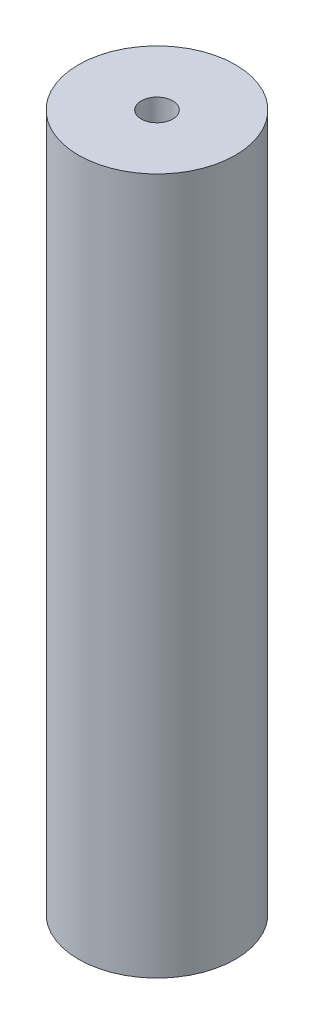
ISO-10303-21;
HEADER;
FILE_DESCRIPTION(('STEP AP214'),'2;1');
FILE_NAME('part.step','',(''),(''),'','','');
FILE_SCHEMA(('AUTOMOTIVE_DESIGN { 1 0 10303 214 1 1 1 1 }'));
ENDSEC;
DATA;
#1=APPLICATION_CONTEXT('core data for automotive mechanical design processes');
#2=APPLICATION_PROTOCOL_DEFINITION('international standard','automotive_design',2000,#1);
#3=PRODUCT_CONTEXT('',#1,'mechanical');
#4=PRODUCT('Part','Part','',(#3));
#5=PRODUCT_RELATED_PRODUCT_CATEGORY('part','',(#4));
#6=PRODUCT_DEFINITION_FORMATION('','',#4);
#7=PRODUCT_DEFINITION_CONTEXT('part definition',#1,'design');
#8=PRODUCT_DEFINITION('design','',#6,#7);
#9=PRODUCT_DEFINITION_SHAPE('','',#8);
#10=(LENGTH_UNIT() NAMED_UNIT(*) SI_UNIT(.MILLI.,.METRE.));
#11=(NAMED_UNIT(*) PLANE_ANGLE_UNIT() SI_UNIT($,.RADIAN.));
#12=(NAMED_UNIT(*) SI_UNIT($,.STERADIAN.) SOLID_ANGLE_UNIT());
#13=UNCERTAINTY_MEASURE_WITH_UNIT(LENGTH_MEASURE(1.E-05),#10,'distance_accuracy_value','');
#14=(GEOMETRIC_REPRESENTATION_CONTEXT(3) GLOBAL_UNCERTAINTY_ASSIGNED_CONTEXT((#13)) GLOBAL_UNIT_ASSIGNED_CONTEXT((#10,
#11,#12)) REPRESENTATION_CONTEXT('',''));
#15=CARTESIAN_POINT('',(0.,0.,0.));
#16=DIRECTION('',(0.,0.,1.));
#17=DIRECTION('',(1.,0.,0.));
#18=AXIS2_PLACEMENT_3D('',#15,#16,#17);
#19=CARTESIAN_POINT('',(412.75,22.225,-25.4));
#20=DIRECTION('',(0.,1.,0.));
#21=DIRECTION('',(0.,0.,-1.));
#22=AXIS2_PLACEMENT_3D('',#19,#20,#21);
#23=PLANE('',#22);
#24=CARTESIAN_POINT('',(412.75,22.225,-25.4));
#25=DIRECTION('',(0.,1.,0.));
#26=DIRECTION('',(1.,0.,0.));
#27=AXIS2_PLACEMENT_3D('',#24,#25,#26);
#28=CIRCLE('',#27,2.55269999999995);
#29=CARTESIAN_POINT('',(410.1973,22.225,-25.4));
#30=VERTEX_POINT('',#29);
#31=EDGE_CURVE('E56',#30,#30,#28,.T.);
#32=ORIENTED_EDGE('',*,*,#31,.T.);
#33=EDGE_LOOP('',(#32));
#34=FACE_BOUND('',#33,.T.);
#35=CARTESIAN_POINT('',(412.75,22.225,-25.4));
#36=DIRECTION('',(0.,-1.,0.));
#37=DIRECTION('',(1.,0.,0.));
#38=AXIS2_PLACEMENT_3D('',#35,#36,#37);
#39=CIRCLE('',#38,12.7);
#40=CARTESIAN_POINT('',(400.05,22.225,-25.4));
#41=VERTEX_POINT('',#40);
#42=EDGE_CURVE('E67',#41,#41,#39,.T.);
#43=ORIENTED_EDGE('',*,*,#42,.T.);
#44=EDGE_LOOP('',(#43));
#45=FACE_BOUND('',#44,.T.);
#46=ADVANCED_FACE('F16',(#34,#45),#23,.F.);
#47=CARTESIAN_POINT('',(412.75,134.9629,-25.4));
#48=DIRECTION('',(0.,-1.,0.));
#49=DIRECTION('',(0.,0.,-1.));
#50=AXIS2_PLACEMENT_3D('',#47,#48,#49);
#51=PLANE('',#50);
#52=CARTESIAN_POINT('',(412.75,134.9629,-25.4));
#53=DIRECTION('',(0.,1.,0.));
#54=DIRECTION('',(1.,0.,0.));
#55=AXIS2_PLACEMENT_3D('',#52,#53,#54);
#56=CIRCLE('',#55,2.55269999999995);
#57=CARTESIAN_POINT('',(410.1973,134.9629,-25.4));
#58=VERTEX_POINT('',#57);
#59=EDGE_CURVE('E49',#58,#58,#56,.T.);
#60=ORIENTED_EDGE('',*,*,#59,.F.);
#61=EDGE_LOOP('',(#60));
#62=FACE_BOUND('',#61,.T.);
#63=CARTESIAN_POINT('',(412.75,134.9629,-25.4));
#64=DIRECTION('',(0.,-1.,0.));
#65=DIRECTION('',(1.,0.,0.));
#66=AXIS2_PLACEMENT_3D('',#63,#64,#65);
#67=CIRCLE('',#66,12.7);
#68=CARTESIAN_POINT('',(400.05,134.9629,-25.4));
#69=VERTEX_POINT('',#68);
#70=EDGE_CURVE('E10',#69,#69,#67,.T.);
#71=ORIENTED_EDGE('',*,*,#70,.F.);
#72=EDGE_LOOP('',(#71));
#73=FACE_BOUND('',#72,.T.);
#74=ADVANCED_FACE('F80',(#62,#73),#51,.F.);
#75=CARTESIAN_POINT('',(412.75,134.9629,-25.4));
#76=DIRECTION('',(0.,-1.,0.));
#77=DIRECTION('',(1.,0.,0.));
#78=AXIS2_PLACEMENT_3D('',#75,#76,#77);
#79=CYLINDRICAL_SURFACE('',#78,12.7);
#80=ORIENTED_EDGE('',*,*,#42,.F.);
#81=DIRECTION('',(0.,1.,0.));
#82=VECTOR('',#81,1.);
#83=CARTESIAN_POINT('',(400.05,134.9629,-25.4));
#84=LINE('',#83,#82);
#85=EDGE_CURVE('E20',#41,#69,#84,.T.);
#86=ORIENTED_EDGE('',*,*,#85,.T.);
#87=ORIENTED_EDGE('',*,*,#70,.T.);
#88=ORIENTED_EDGE('',*,*,#85,.F.);
#89=EDGE_LOOP('',(#80,#86,#87,#88));
#90=FACE_BOUND('',#89,.T.);
#91=ADVANCED_FACE('F18',(#90),#79,.T.);
#92=CARTESIAN_POINT('',(412.75,134.9629,-25.4));
#93=DIRECTION('',(0.,-1.,0.));
#94=DIRECTION('',(1.,0.,0.));
#95=AXIS2_PLACEMENT_3D('',#92,#93,#94);
#96=CYLINDRICAL_SURFACE('',#95,2.55269999999995);
#97=ORIENTED_EDGE('',*,*,#31,.F.);
#98=DIRECTION('',(0.,1.,0.));
#99=VECTOR('',#98,1.);
#100=CARTESIAN_POINT('',(410.1973,134.9629,-25.4));
#101=LINE('',#100,#99);
#102=EDGE_CURVE('E53',#30,#58,#101,.T.);
#103=ORIENTED_EDGE('',*,*,#102,.T.);
#104=ORIENTED_EDGE('',*,*,#59,.T.);
#105=ORIENTED_EDGE('',*,*,#102,.F.);
#106=EDGE_LOOP('',(#97,#103,#104,#105));
#107=FACE_BOUND('',#106,.T.);
#108=ADVANCED_FACE('F55',(#107),#96,.F.);
#109=CLOSED_SHELL('',(#46,#74,#91,#108));
#110=MANIFOLD_SOLID_BREP('B1',#109);
#111=ADVANCED_BREP_SHAPE_REPRESENTATION('',(#18,#110),#14);
#112=SHAPE_DEFINITION_REPRESENTATION(#9,#111);
ENDSEC;
END-ISO-10303-21;
